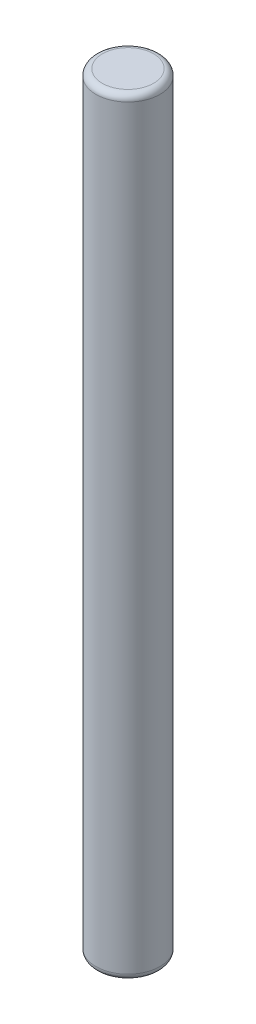
ISO-10303-21;
HEADER;
FILE_DESCRIPTION(('STEP AP214'),'2;1');
FILE_NAME('part.step','',(''),(''),'','','');
FILE_SCHEMA(('AUTOMOTIVE_DESIGN { 1 0 10303 214 1 1 1 1 }'));
ENDSEC;
DATA;
#1=APPLICATION_CONTEXT('core data for automotive mechanical design processes');
#2=APPLICATION_PROTOCOL_DEFINITION('international standard','automotive_design',2000,#1);
#3=PRODUCT_CONTEXT('',#1,'mechanical');
#4=PRODUCT('Part','Part','',(#3));
#5=PRODUCT_RELATED_PRODUCT_CATEGORY('part','',(#4));
#6=PRODUCT_DEFINITION_FORMATION('','',#4);
#7=PRODUCT_DEFINITION_CONTEXT('part definition',#1,'design');
#8=PRODUCT_DEFINITION('design','',#6,#7);
#9=PRODUCT_DEFINITION_SHAPE('','',#8);
#10=(LENGTH_UNIT() NAMED_UNIT(*) SI_UNIT(.MILLI.,.METRE.));
#11=(NAMED_UNIT(*) PLANE_ANGLE_UNIT() SI_UNIT($,.RADIAN.));
#12=(NAMED_UNIT(*) SI_UNIT($,.STERADIAN.) SOLID_ANGLE_UNIT());
#13=UNCERTAINTY_MEASURE_WITH_UNIT(LENGTH_MEASURE(1.E-05),#10,'distance_accuracy_value','');
#14=(GEOMETRIC_REPRESENTATION_CONTEXT(3) GLOBAL_UNCERTAINTY_ASSIGNED_CONTEXT((#13)) GLOBAL_UNIT_ASSIGNED_CONTEXT((#10,
#11,#12)) REPRESENTATION_CONTEXT('',''));
#15=CARTESIAN_POINT('',(0.,0.,0.));
#16=DIRECTION('',(0.,0.,1.));
#17=DIRECTION('',(1.,0.,0.));
#18=AXIS2_PLACEMENT_3D('',#15,#16,#17);
#19=CARTESIAN_POINT('',(0.,24.,0.));
#20=DIRECTION('',(0.,-1.,0.));
#21=DIRECTION('',(0.,0.,-1.));
#22=AXIS2_PLACEMENT_3D('',#19,#20,#21);
#23=CYLINDRICAL_SURFACE('',#22,1.);
#24=CARTESIAN_POINT('',(0.,0.199999999999999,0.));
#25=DIRECTION('',(0.,1.,0.));
#26=DIRECTION('',(0.,0.,1.));
#27=AXIS2_PLACEMENT_3D('',#24,#25,#26);
#28=CIRCLE('',#27,1.);
#29=CARTESIAN_POINT('',(0.,0.199999999999999,1.));
#30=VERTEX_POINT('',#29);
#31=EDGE_CURVE('E46',#30,#30,#28,.T.);
#32=ORIENTED_EDGE('',*,*,#31,.T.);
#33=EDGE_LOOP('',(#32));
#34=FACE_BOUND('',#33,.T.);
#35=CARTESIAN_POINT('',(0.,23.8,0.));
#36=DIRECTION('',(0.,1.,0.));
#37=DIRECTION('',(0.,0.,1.));
#38=AXIS2_PLACEMENT_3D('',#35,#36,#37);
#39=CIRCLE('',#38,1.);
#40=CARTESIAN_POINT('',(0.,23.8,1.));
#41=VERTEX_POINT('',#40);
#42=EDGE_CURVE('E50',#41,#41,#39,.F.);
#43=ORIENTED_EDGE('',*,*,#42,.T.);
#44=EDGE_LOOP('',(#43));
#45=FACE_BOUND('',#44,.T.);
#46=ADVANCED_FACE('F35',(#34,#45),#23,.T.);
#47=CARTESIAN_POINT('',(0.,24.,0.));
#48=DIRECTION('',(0.,1.,0.));
#49=DIRECTION('',(0.,0.,1.));
#50=AXIS2_PLACEMENT_3D('',#47,#48,#49);
#51=PLANE('',#50);
#52=CARTESIAN_POINT('',(0.,24.,0.));
#53=DIRECTION('',(0.,1.,0.));
#54=DIRECTION('',(0.,0.,1.));
#55=AXIS2_PLACEMENT_3D('',#52,#53,#54);
#56=CIRCLE('',#55,0.8);
#57=CARTESIAN_POINT('',(0.,24.,0.8));
#58=VERTEX_POINT('',#57);
#59=EDGE_CURVE('E10',#58,#58,#56,.T.);
#60=ORIENTED_EDGE('',*,*,#59,.T.);
#61=EDGE_LOOP('',(#60));
#62=FACE_BOUND('',#61,.T.);
#63=ADVANCED_FACE('F66',(#62),#51,.T.);
#64=CARTESIAN_POINT('',(0.,0.,0.));
#65=DIRECTION('',(0.,1.,0.));
#66=DIRECTION('',(0.,0.,1.));
#67=AXIS2_PLACEMENT_3D('',#64,#65,#66);
#68=PLANE('',#67);
#69=CARTESIAN_POINT('',(0.,0.,0.));
#70=DIRECTION('',(0.,1.,0.));
#71=DIRECTION('',(0.,0.,1.));
#72=AXIS2_PLACEMENT_3D('',#69,#70,#71);
#73=CIRCLE('',#72,0.8);
#74=CARTESIAN_POINT('',(0.,0.,0.8));
#75=VERTEX_POINT('',#74);
#76=EDGE_CURVE('E42',#75,#75,#73,.F.);
#77=ORIENTED_EDGE('',*,*,#76,.T.);
#78=EDGE_LOOP('',(#77));
#79=FACE_BOUND('',#78,.T.);
#80=ADVANCED_FACE('F63',(#79),#68,.F.);
#81=CARTESIAN_POINT('',(0.,0.199999999999999,0.));
#82=DIRECTION('',(0.,1.,0.));
#83=DIRECTION('',(0.,0.,1.));
#84=AXIS2_PLACEMENT_3D('',#81,#82,#83);
#85=TOROIDAL_SURFACE('',#84,0.8,0.2);
#86=ORIENTED_EDGE('',*,*,#76,.F.);
#87=EDGE_LOOP('',(#86));
#88=FACE_BOUND('',#87,.T.);
#89=ORIENTED_EDGE('',*,*,#31,.F.);
#90=EDGE_LOOP('',(#89));
#91=FACE_BOUND('',#90,.T.);
#92=ADVANCED_FACE('F59',(#88,#91),#85,.T.);
#93=CARTESIAN_POINT('',(0.,23.8,0.));
#94=DIRECTION('',(0.,1.,0.));
#95=DIRECTION('',(0.,0.,1.));
#96=AXIS2_PLACEMENT_3D('',#93,#94,#95);
#97=TOROIDAL_SURFACE('',#96,0.8,0.2);
#98=ORIENTED_EDGE('',*,*,#42,.F.);
#99=EDGE_LOOP('',(#98));
#100=FACE_BOUND('',#99,.T.);
#101=ORIENTED_EDGE('',*,*,#59,.F.);
#102=EDGE_LOOP('',(#101));
#103=FACE_BOUND('',#102,.T.);
#104=ADVANCED_FACE('F37',(#100,#103),#97,.T.);
#105=CLOSED_SHELL('',(#46,#63,#80,#92,#104));
#106=MANIFOLD_SOLID_BREP('B2',#105);
#107=ADVANCED_BREP_SHAPE_REPRESENTATION('',(#18,#106),#14);
#108=SHAPE_DEFINITION_REPRESENTATION(#9,#107);
ENDSEC;
END-ISO-10303-21;
